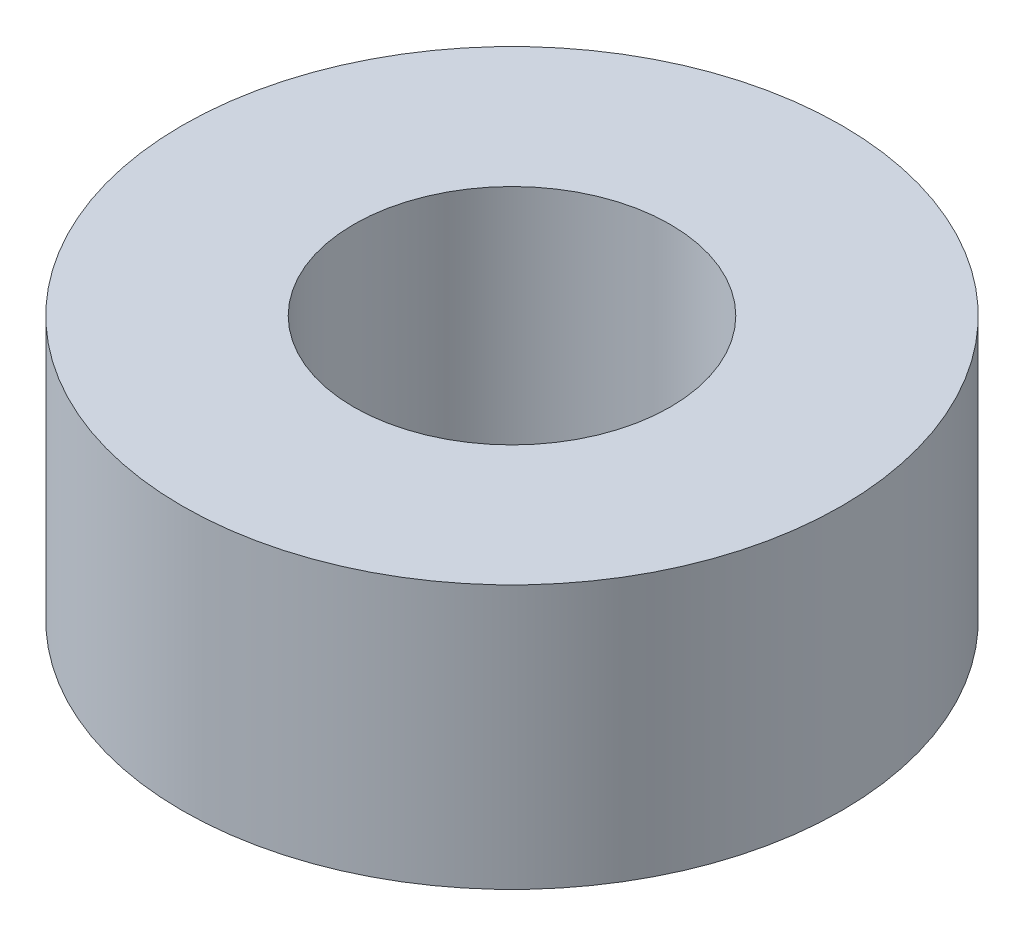
ISO-10303-21;
HEADER;
FILE_DESCRIPTION(('STEP AP214'),'2;1');
FILE_NAME('part.step','',(''),(''),'','','');
FILE_SCHEMA(('AUTOMOTIVE_DESIGN { 1 0 10303 214 1 1 1 1 }'));
ENDSEC;
DATA;
#1=APPLICATION_CONTEXT('core data for automotive mechanical design processes');
#2=APPLICATION_PROTOCOL_DEFINITION('international standard','automotive_design',2000,#1);
#3=PRODUCT_CONTEXT('',#1,'mechanical');
#4=PRODUCT('Part','Part','',(#3));
#5=PRODUCT_RELATED_PRODUCT_CATEGORY('part','',(#4));
#6=PRODUCT_DEFINITION_FORMATION('','',#4);
#7=PRODUCT_DEFINITION_CONTEXT('part definition',#1,'design');
#8=PRODUCT_DEFINITION('design','',#6,#7);
#9=PRODUCT_DEFINITION_SHAPE('','',#8);
#10=(LENGTH_UNIT() NAMED_UNIT(*) SI_UNIT(.MILLI.,.METRE.));
#11=(NAMED_UNIT(*) PLANE_ANGLE_UNIT() SI_UNIT($,.RADIAN.));
#12=(NAMED_UNIT(*) SI_UNIT($,.STERADIAN.) SOLID_ANGLE_UNIT());
#13=UNCERTAINTY_MEASURE_WITH_UNIT(LENGTH_MEASURE(1.E-05),#10,'distance_accuracy_value','');
#14=(GEOMETRIC_REPRESENTATION_CONTEXT(3) GLOBAL_UNCERTAINTY_ASSIGNED_CONTEXT((#13)) GLOBAL_UNIT_ASSIGNED_CONTEXT((#10,
#11,#12)) REPRESENTATION_CONTEXT('',''));
#15=CARTESIAN_POINT('',(0.,0.,0.));
#16=DIRECTION('',(0.,0.,1.));
#17=DIRECTION('',(1.,0.,0.));
#18=AXIS2_PLACEMENT_3D('',#15,#16,#17);
#19=CARTESIAN_POINT('',(0.,5.08,0.));
#20=DIRECTION('',(0.,-1.,0.));
#21=DIRECTION('',(0.,0.,-1.));
#22=AXIS2_PLACEMENT_3D('',#19,#20,#21);
#23=CYLINDRICAL_SURFACE('',#22,6.35);
#24=CARTESIAN_POINT('',(0.,5.08,0.));
#25=DIRECTION('',(0.,1.,0.));
#26=DIRECTION('',(0.,0.,1.));
#27=AXIS2_PLACEMENT_3D('',#24,#25,#26);
#28=CIRCLE('',#27,6.35);
#29=CARTESIAN_POINT('',(0.,5.08,6.35));
#30=VERTEX_POINT('',#29);
#31=EDGE_CURVE('E10',#30,#30,#28,.T.);
#32=ORIENTED_EDGE('',*,*,#31,.F.);
#33=EDGE_LOOP('',(#32));
#34=FACE_BOUND('',#33,.T.);
#35=CARTESIAN_POINT('',(0.,0.,0.));
#36=DIRECTION('',(0.,1.,0.));
#37=DIRECTION('',(0.,0.,1.));
#38=AXIS2_PLACEMENT_3D('',#35,#36,#37);
#39=CIRCLE('',#38,6.35);
#40=CARTESIAN_POINT('',(0.,0.,6.35));
#41=VERTEX_POINT('',#40);
#42=EDGE_CURVE('E34',#41,#41,#39,.T.);
#43=ORIENTED_EDGE('',*,*,#42,.T.);
#44=EDGE_LOOP('',(#43));
#45=FACE_BOUND('',#44,.T.);
#46=ADVANCED_FACE('F31',(#34,#45),#23,.T.);
#47=CARTESIAN_POINT('',(0.,5.08,0.));
#48=DIRECTION('',(0.,1.,0.));
#49=DIRECTION('',(0.,0.,1.));
#50=AXIS2_PLACEMENT_3D('',#47,#48,#49);
#51=PLANE('',#50);
#52=CARTESIAN_POINT('',(0.,5.08,0.));
#53=DIRECTION('',(0.,1.,0.));
#54=DIRECTION('',(0.,0.,1.));
#55=AXIS2_PLACEMENT_3D('',#52,#53,#54);
#56=CIRCLE('',#55,3.048);
#57=CARTESIAN_POINT('',(0.,5.08,3.048));
#58=VERTEX_POINT('',#57);
#59=EDGE_CURVE('E43',#58,#58,#56,.T.);
#60=ORIENTED_EDGE('',*,*,#59,.F.);
#61=EDGE_LOOP('',(#60));
#62=FACE_BOUND('',#61,.T.);
#63=ORIENTED_EDGE('',*,*,#31,.T.);
#64=EDGE_LOOP('',(#63));
#65=FACE_BOUND('',#64,.T.);
#66=ADVANCED_FACE('F58',(#62,#65),#51,.T.);
#67=CARTESIAN_POINT('',(0.,0.,0.));
#68=DIRECTION('',(0.,1.,0.));
#69=DIRECTION('',(0.,0.,1.));
#70=AXIS2_PLACEMENT_3D('',#67,#68,#69);
#71=PLANE('',#70);
#72=CARTESIAN_POINT('',(0.,0.,0.));
#73=DIRECTION('',(0.,1.,0.));
#74=DIRECTION('',(0.,0.,1.));
#75=AXIS2_PLACEMENT_3D('',#72,#73,#74);
#76=CIRCLE('',#75,3.048);
#77=CARTESIAN_POINT('',(0.,0.,3.048));
#78=VERTEX_POINT('',#77);
#79=EDGE_CURVE('E41',#78,#78,#76,.T.);
#80=ORIENTED_EDGE('',*,*,#79,.T.);
#81=EDGE_LOOP('',(#80));
#82=FACE_BOUND('',#81,.T.);
#83=ORIENTED_EDGE('',*,*,#42,.F.);
#84=EDGE_LOOP('',(#83));
#85=FACE_BOUND('',#84,.T.);
#86=ADVANCED_FACE('F49',(#82,#85),#71,.F.);
#87=CARTESIAN_POINT('',(0.,0.,0.));
#88=DIRECTION('',(0.,1.,0.));
#89=DIRECTION('',(0.,0.,1.));
#90=AXIS2_PLACEMENT_3D('',#87,#88,#89);
#91=CYLINDRICAL_SURFACE('',#90,3.048);
#92=ORIENTED_EDGE('',*,*,#79,.F.);
#93=EDGE_LOOP('',(#92));
#94=FACE_BOUND('',#93,.T.);
#95=ORIENTED_EDGE('',*,*,#59,.T.);
#96=EDGE_LOOP('',(#95));
#97=FACE_BOUND('',#96,.T.);
#98=ADVANCED_FACE('F52',(#94,#97),#91,.F.);
#99=CLOSED_SHELL('',(#46,#66,#86,#98));
#100=MANIFOLD_SOLID_BREP('B2',#99);
#101=ADVANCED_BREP_SHAPE_REPRESENTATION('',(#18,#100),#14);
#102=SHAPE_DEFINITION_REPRESENTATION(#9,#101);
ENDSEC;
END-ISO-10303-21;
